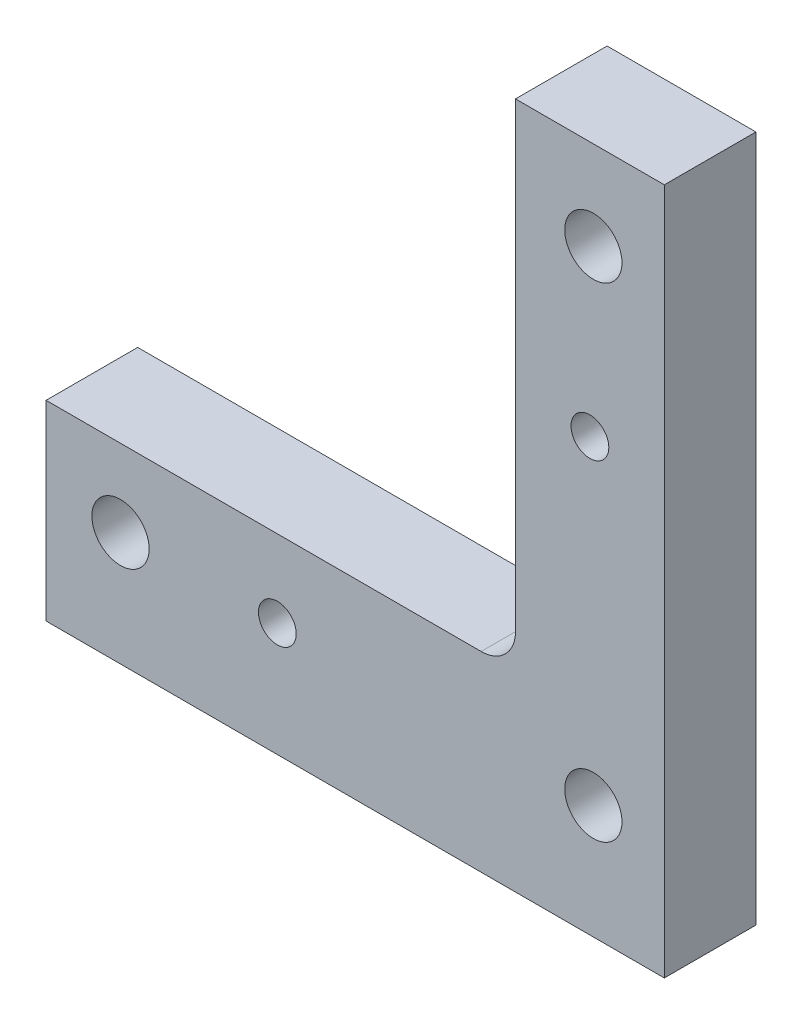
ISO-10303-21;
HEADER;
FILE_DESCRIPTION(('STEP AP214'),'2;1');
FILE_NAME('part.step','',(''),(''),'','','');
FILE_SCHEMA(('AUTOMOTIVE_DESIGN { 1 0 10303 214 1 1 1 1 }'));
ENDSEC;
DATA;
#1=APPLICATION_CONTEXT('core data for automotive mechanical design processes');
#2=APPLICATION_PROTOCOL_DEFINITION('international standard','automotive_design',2000,#1);
#3=PRODUCT_CONTEXT('',#1,'mechanical');
#4=PRODUCT('Part','Part','',(#3));
#5=PRODUCT_RELATED_PRODUCT_CATEGORY('part','',(#4));
#6=PRODUCT_DEFINITION_FORMATION('','',#4);
#7=PRODUCT_DEFINITION_CONTEXT('part definition',#1,'design');
#8=PRODUCT_DEFINITION('design','',#6,#7);
#9=PRODUCT_DEFINITION_SHAPE('','',#8);
#10=(LENGTH_UNIT() NAMED_UNIT(*) SI_UNIT(.MILLI.,.METRE.));
#11=(NAMED_UNIT(*) PLANE_ANGLE_UNIT() SI_UNIT($,.RADIAN.));
#12=(NAMED_UNIT(*) SI_UNIT($,.STERADIAN.) SOLID_ANGLE_UNIT());
#13=UNCERTAINTY_MEASURE_WITH_UNIT(LENGTH_MEASURE(1.E-05),#10,'distance_accuracy_value','');
#14=(GEOMETRIC_REPRESENTATION_CONTEXT(3) GLOBAL_UNCERTAINTY_ASSIGNED_CONTEXT((#13)) GLOBAL_UNIT_ASSIGNED_CONTEXT((#10,
#11,#12)) REPRESENTATION_CONTEXT('',''));
#15=CARTESIAN_POINT('',(0.,0.,0.));
#16=DIRECTION('',(0.,0.,1.));
#17=DIRECTION('',(1.,0.,0.));
#18=AXIS2_PLACEMENT_3D('',#15,#16,#17);
#19=CARTESIAN_POINT('',(20.2,9.95000000000001,0.));
#20=DIRECTION('',(0.,0.,1.));
#21=DIRECTION('',(1.,0.,0.));
#22=AXIS2_PLACEMENT_3D('',#19,#20,#21);
#23=CYLINDRICAL_SURFACE('',#22,1.65);
#24=CARTESIAN_POINT('',(20.2,9.95000000000001,0.));
#25=DIRECTION('',(0.,0.,1.));
#26=DIRECTION('',(1.,0.,0.));
#27=AXIS2_PLACEMENT_3D('',#24,#25,#26);
#28=CIRCLE('',#27,1.65);
#29=CARTESIAN_POINT('',(21.85,9.95000000000001,0.));
#30=VERTEX_POINT('',#29);
#31=EDGE_CURVE('E117',#30,#30,#28,.T.);
#32=ORIENTED_EDGE('',*,*,#31,.F.);
#33=EDGE_LOOP('',(#32));
#34=FACE_BOUND('',#33,.T.);
#35=CARTESIAN_POINT('',(20.2,9.95000000000001,8.));
#36=DIRECTION('',(0.,0.,1.));
#37=DIRECTION('',(1.,0.,0.));
#38=AXIS2_PLACEMENT_3D('',#35,#36,#37);
#39=CIRCLE('',#38,1.65);
#40=CARTESIAN_POINT('',(21.85,9.95000000000001,8.));
#41=VERTEX_POINT('',#40);
#42=EDGE_CURVE('E11',#41,#41,#39,.T.);
#43=ORIENTED_EDGE('',*,*,#42,.T.);
#44=EDGE_LOOP('',(#43));
#45=FACE_BOUND('',#44,.T.);
#46=ADVANCED_FACE('F16',(#34,#45),#23,.F.);
#47=CARTESIAN_POINT('',(47.8,9.95,0.));
#48=DIRECTION('',(0.,0.,1.));
#49=DIRECTION('',(1.,0.,0.));
#50=AXIS2_PLACEMENT_3D('',#47,#48,#49);
#51=CYLINDRICAL_SURFACE('',#50,2.5);
#52=CARTESIAN_POINT('',(47.8,9.95,0.));
#53=DIRECTION('',(0.,0.,1.));
#54=DIRECTION('',(1.,0.,0.));
#55=AXIS2_PLACEMENT_3D('',#52,#53,#54);
#56=CIRCLE('',#55,2.5);
#57=CARTESIAN_POINT('',(50.3,9.95,0.));
#58=VERTEX_POINT('',#57);
#59=EDGE_CURVE('E172',#58,#58,#56,.T.);
#60=ORIENTED_EDGE('',*,*,#59,.F.);
#61=EDGE_LOOP('',(#60));
#62=FACE_BOUND('',#61,.T.);
#63=CARTESIAN_POINT('',(47.8,9.95,8.));
#64=DIRECTION('',(0.,0.,1.));
#65=DIRECTION('',(1.,0.,0.));
#66=AXIS2_PLACEMENT_3D('',#63,#64,#65);
#67=CIRCLE('',#66,2.5);
#68=CARTESIAN_POINT('',(50.3,9.95,8.));
#69=VERTEX_POINT('',#68);
#70=EDGE_CURVE('E25',#69,#69,#67,.T.);
#71=ORIENTED_EDGE('',*,*,#70,.T.);
#72=EDGE_LOOP('',(#71));
#73=FACE_BOUND('',#72,.T.);
#74=ADVANCED_FACE('F183',(#62,#73),#51,.F.);
#75=CARTESIAN_POINT('',(47.5,37.7,0.));
#76=DIRECTION('',(0.,0.,1.));
#77=DIRECTION('',(1.,0.,0.));
#78=AXIS2_PLACEMENT_3D('',#75,#76,#77);
#79=CYLINDRICAL_SURFACE('',#78,1.64999999999999);
#80=CARTESIAN_POINT('',(47.5,37.7,0.));
#81=DIRECTION('',(0.,0.,1.));
#82=DIRECTION('',(1.,0.,0.));
#83=AXIS2_PLACEMENT_3D('',#80,#81,#82);
#84=CIRCLE('',#83,1.64999999999999);
#85=CARTESIAN_POINT('',(49.15,37.7,0.));
#86=VERTEX_POINT('',#85);
#87=EDGE_CURVE('E167',#86,#86,#84,.T.);
#88=ORIENTED_EDGE('',*,*,#87,.F.);
#89=EDGE_LOOP('',(#88));
#90=FACE_BOUND('',#89,.T.);
#91=CARTESIAN_POINT('',(47.5,37.7,8.));
#92=DIRECTION('',(0.,0.,1.));
#93=DIRECTION('',(1.,0.,0.));
#94=AXIS2_PLACEMENT_3D('',#91,#92,#93);
#95=CIRCLE('',#94,1.64999999999999);
#96=CARTESIAN_POINT('',(49.15,37.7,8.));
#97=VERTEX_POINT('',#96);
#98=EDGE_CURVE('E164',#97,#97,#95,.T.);
#99=ORIENTED_EDGE('',*,*,#98,.T.);
#100=EDGE_LOOP('',(#99));
#101=FACE_BOUND('',#100,.T.);
#102=ADVANCED_FACE('F212',(#90,#101),#79,.F.);
#103=CARTESIAN_POINT('',(6.5,9.95,0.));
#104=DIRECTION('',(0.,0.,1.));
#105=DIRECTION('',(1.,0.,0.));
#106=AXIS2_PLACEMENT_3D('',#103,#104,#105);
#107=CYLINDRICAL_SURFACE('',#106,2.5);
#108=CARTESIAN_POINT('',(6.5,9.95,0.));
#109=DIRECTION('',(0.,0.,1.));
#110=DIRECTION('',(1.,0.,0.));
#111=AXIS2_PLACEMENT_3D('',#108,#109,#110);
#112=CIRCLE('',#111,2.5);
#113=CARTESIAN_POINT('',(9.,9.95,0.));
#114=VERTEX_POINT('',#113);
#115=EDGE_CURVE('E161',#114,#114,#112,.T.);
#116=ORIENTED_EDGE('',*,*,#115,.F.);
#117=EDGE_LOOP('',(#116));
#118=FACE_BOUND('',#117,.T.);
#119=CARTESIAN_POINT('',(6.5,9.95,8.));
#120=DIRECTION('',(0.,0.,1.));
#121=DIRECTION('',(1.,0.,0.));
#122=AXIS2_PLACEMENT_3D('',#119,#120,#121);
#123=CIRCLE('',#122,2.5);
#124=CARTESIAN_POINT('',(9.,9.95,8.));
#125=VERTEX_POINT('',#124);
#126=EDGE_CURVE('E157',#125,#125,#123,.T.);
#127=ORIENTED_EDGE('',*,*,#126,.T.);
#128=EDGE_LOOP('',(#127));
#129=FACE_BOUND('',#128,.T.);
#130=ADVANCED_FACE('F202',(#118,#129),#107,.F.);
#131=CARTESIAN_POINT('',(47.8,52.25,0.));
#132=DIRECTION('',(0.,0.,1.));
#133=DIRECTION('',(1.,0.,0.));
#134=AXIS2_PLACEMENT_3D('',#131,#132,#133);
#135=CYLINDRICAL_SURFACE('',#134,2.5);
#136=CARTESIAN_POINT('',(47.8,52.25,0.));
#137=DIRECTION('',(0.,0.,1.));
#138=DIRECTION('',(1.,0.,0.));
#139=AXIS2_PLACEMENT_3D('',#136,#137,#138);
#140=CIRCLE('',#139,2.5);
#141=CARTESIAN_POINT('',(50.3,52.25,0.));
#142=VERTEX_POINT('',#141);
#143=EDGE_CURVE('E158',#142,#142,#140,.T.);
#144=ORIENTED_EDGE('',*,*,#143,.F.);
#145=EDGE_LOOP('',(#144));
#146=FACE_BOUND('',#145,.T.);
#147=CARTESIAN_POINT('',(47.8,52.25,8.));
#148=DIRECTION('',(0.,0.,1.));
#149=DIRECTION('',(1.,0.,0.));
#150=AXIS2_PLACEMENT_3D('',#147,#148,#149);
#151=CIRCLE('',#150,2.5);
#152=CARTESIAN_POINT('',(50.3,52.25,8.));
#153=VERTEX_POINT('',#152);
#154=EDGE_CURVE('E152',#153,#153,#151,.T.);
#155=ORIENTED_EDGE('',*,*,#154,.T.);
#156=EDGE_LOOP('',(#155));
#157=FACE_BOUND('',#156,.T.);
#158=ADVANCED_FACE('F199',(#146,#157),#135,.F.);
#159=CARTESIAN_POINT('',(13.,0.,3.99999999999999));
#160=DIRECTION('',(0.,-1.,0.));
#161=DIRECTION('',(0.,0.,-1.));
#162=AXIS2_PLACEMENT_3D('',#159,#160,#161);
#163=CYLINDRICAL_SURFACE('',#162,1.64999999999999);
#164=CARTESIAN_POINT('',(13.,10.,3.99999999999999));
#165=DIRECTION('',(0.,-1.,0.));
#166=DIRECTION('',(0.,0.,-1.));
#167=AXIS2_PLACEMENT_3D('',#164,#165,#166);
#168=CIRCLE('',#167,1.65);
#169=CARTESIAN_POINT('',(13.,10.,2.35));
#170=VERTEX_POINT('',#169);
#171=EDGE_CURVE('E146',#170,#170,#168,.T.);
#172=ORIENTED_EDGE('',*,*,#171,.F.);
#173=EDGE_LOOP('',(#172));
#174=FACE_BOUND('',#173,.T.);
#175=CARTESIAN_POINT('',(13.,0.,3.99999999999999));
#176=DIRECTION('',(0.,-1.,0.));
#177=DIRECTION('',(0.,0.,-1.));
#178=AXIS2_PLACEMENT_3D('',#175,#176,#177);
#179=CIRCLE('',#178,1.64999999999999);
#180=CARTESIAN_POINT('',(13.,0.,2.35));
#181=VERTEX_POINT('',#180);
#182=EDGE_CURVE('E149',#181,#181,#179,.T.);
#183=ORIENTED_EDGE('',*,*,#182,.T.);
#184=EDGE_LOOP('',(#183));
#185=FACE_BOUND('',#184,.T.);
#186=ADVANCED_FACE('F201',(#174,#185),#163,.F.);
#187=CARTESIAN_POINT('',(13.,10.,3.99999999999999));
#188=DIRECTION('',(0.,-1.,0.));
#189=DIRECTION('',(0.,0.,-1.));
#190=AXIS2_PLACEMENT_3D('',#187,#188,#189);
#191=CONICAL_SURFACE('',#190,1.65,1.02974425867665);
#192=CARTESIAN_POINT('',(13.,10.9914200213955,3.99999999999999));
#193=VERTEX_POINT('',#192);
#194=VERTEX_LOOP('',#193);
#195=FACE_BOUND('',#194,.T.);
#196=ORIENTED_EDGE('',*,*,#171,.T.);
#197=EDGE_LOOP('',(#196));
#198=FACE_BOUND('',#197,.T.);
#199=ADVANCED_FACE('F210',(#195,#198),#191,.F.);
#200=CARTESIAN_POINT('',(41.,0.,4.));
#201=DIRECTION('',(0.,-1.,0.));
#202=DIRECTION('',(0.,0.,-1.));
#203=AXIS2_PLACEMENT_3D('',#200,#201,#202);
#204=CYLINDRICAL_SURFACE('',#203,1.65);
#205=CARTESIAN_POINT('',(41.,10.,4.));
#206=DIRECTION('',(0.,-1.,0.));
#207=DIRECTION('',(0.,0.,-1.));
#208=AXIS2_PLACEMENT_3D('',#205,#206,#207);
#209=CIRCLE('',#208,1.65);
#210=CARTESIAN_POINT('',(41.,10.,2.35));
#211=VERTEX_POINT('',#210);
#212=EDGE_CURVE('E97',#211,#211,#209,.T.);
#213=ORIENTED_EDGE('',*,*,#212,.F.);
#214=EDGE_LOOP('',(#213));
#215=FACE_BOUND('',#214,.T.);
#216=CARTESIAN_POINT('',(41.,0.,4.));
#217=DIRECTION('',(0.,-1.,0.));
#218=DIRECTION('',(0.,0.,-1.));
#219=AXIS2_PLACEMENT_3D('',#216,#217,#218);
#220=CIRCLE('',#219,1.64999999999999);
#221=CARTESIAN_POINT('',(41.,0.,2.35));
#222=VERTEX_POINT('',#221);
#223=EDGE_CURVE('E143',#222,#222,#220,.T.);
#224=ORIENTED_EDGE('',*,*,#223,.T.);
#225=EDGE_LOOP('',(#224));
#226=FACE_BOUND('',#225,.T.);
#227=ADVANCED_FACE('F221',(#215,#226),#204,.F.);
#228=CARTESIAN_POINT('',(41.,10.,4.));
#229=DIRECTION('',(0.,-1.,0.));
#230=DIRECTION('',(0.,0.,-1.));
#231=AXIS2_PLACEMENT_3D('',#228,#229,#230);
#232=CONICAL_SURFACE('',#231,1.65,1.02974425867665);
#233=CARTESIAN_POINT('',(41.,10.9914200213955,4.));
#234=VERTEX_POINT('',#233);
#235=VERTEX_LOOP('',#234);
#236=FACE_BOUND('',#235,.T.);
#237=ORIENTED_EDGE('',*,*,#212,.T.);
#238=EDGE_LOOP('',(#237));
#239=FACE_BOUND('',#238,.T.);
#240=ADVANCED_FACE('F218',(#236,#239),#232,.F.);
#241=CARTESIAN_POINT('',(0.,16.7,8.));
#242=DIRECTION('',(1.,0.,0.));
#243=DIRECTION('',(0.,1.,0.));
#244=AXIS2_PLACEMENT_3D('',#241,#242,#243);
#245=PLANE('',#244);
#246=DIRECTION('',(0.,-1.,0.));
#247=VECTOR('',#246,1.);
#248=CARTESIAN_POINT('',(0.,16.7,0.));
#249=LINE('',#248,#247);
#250=CARTESIAN_POINT('',(0.,16.7,0.));
#251=VERTEX_POINT('',#250);
#252=CARTESIAN_POINT('',(0.,0.,0.));
#253=VERTEX_POINT('',#252);
#254=EDGE_CURVE('E81',#251,#253,#249,.T.);
#255=ORIENTED_EDGE('',*,*,#254,.T.);
#256=DIRECTION('',(0.,0.,-1.));
#257=VECTOR('',#256,1.);
#258=CARTESIAN_POINT('',(0.,0.,8.));
#259=LINE('',#258,#257);
#260=CARTESIAN_POINT('',(0.,0.,8.));
#261=VERTEX_POINT('',#260);
#262=EDGE_CURVE('E138',#261,#253,#259,.T.);
#263=ORIENTED_EDGE('',*,*,#262,.F.);
#264=DIRECTION('',(0.,-1.,0.));
#265=VECTOR('',#264,1.);
#266=CARTESIAN_POINT('',(0.,16.7,8.));
#267=LINE('',#266,#265);
#268=CARTESIAN_POINT('',(0.,16.7,8.));
#269=VERTEX_POINT('',#268);
#270=EDGE_CURVE('E83',#269,#261,#267,.T.);
#271=ORIENTED_EDGE('',*,*,#270,.F.);
#272=DIRECTION('',(0.,0.,-1.));
#273=VECTOR('',#272,1.);
#274=CARTESIAN_POINT('',(0.,16.7,8.));
#275=LINE('',#274,#273);
#276=EDGE_CURVE('E77',#269,#251,#275,.T.);
#277=ORIENTED_EDGE('',*,*,#276,.T.);
#278=EDGE_LOOP('',(#255,#263,#271,#277));
#279=FACE_BOUND('',#278,.T.);
#280=ADVANCED_FACE('F79',(#279),#245,.F.);
#281=CARTESIAN_POINT('',(0.,0.,8.));
#282=DIRECTION('',(0.,1.,0.));
#283=DIRECTION('',(0.,0.,1.));
#284=AXIS2_PLACEMENT_3D('',#281,#282,#283);
#285=PLANE('',#284);
#286=DIRECTION('',(1.,0.,0.));
#287=VECTOR('',#286,1.);
#288=CARTESIAN_POINT('',(0.,0.,0.));
#289=LINE('',#288,#287);
#290=CARTESIAN_POINT('',(54.,0.,0.));
#291=VERTEX_POINT('',#290);
#292=EDGE_CURVE('E87',#253,#291,#289,.T.);
#293=ORIENTED_EDGE('',*,*,#292,.T.);
#294=DIRECTION('',(0.,0.,-1.));
#295=VECTOR('',#294,1.);
#296=CARTESIAN_POINT('',(54.,0.,8.));
#297=LINE('',#296,#295);
#298=CARTESIAN_POINT('',(54.,0.,8.));
#299=VERTEX_POINT('',#298);
#300=EDGE_CURVE('E132',#299,#291,#297,.T.);
#301=ORIENTED_EDGE('',*,*,#300,.F.);
#302=DIRECTION('',(1.,0.,0.));
#303=VECTOR('',#302,1.);
#304=CARTESIAN_POINT('',(0.,0.,8.));
#305=LINE('',#304,#303);
#306=EDGE_CURVE('E106',#261,#299,#305,.T.);
#307=ORIENTED_EDGE('',*,*,#306,.F.);
#308=ORIENTED_EDGE('',*,*,#262,.T.);
#309=EDGE_LOOP('',(#293,#301,#307,#308));
#310=FACE_BOUND('',#309,.T.);
#311=ORIENTED_EDGE('',*,*,#182,.F.);
#312=EDGE_LOOP('',(#311));
#313=FACE_BOUND('',#312,.T.);
#314=ORIENTED_EDGE('',*,*,#223,.F.);
#315=EDGE_LOOP('',(#314));
#316=FACE_BOUND('',#315,.T.);
#317=ADVANCED_FACE('F231',(#310,#313,#316),#285,.F.);
#318=CARTESIAN_POINT('',(54.,0.,8.));
#319=DIRECTION('',(-1.,0.,0.));
#320=DIRECTION('',(0.,0.,1.));
#321=AXIS2_PLACEMENT_3D('',#318,#319,#320);
#322=PLANE('',#321);
#323=DIRECTION('',(0.,1.,0.));
#324=VECTOR('',#323,1.);
#325=CARTESIAN_POINT('',(54.,0.,0.));
#326=LINE('',#325,#324);
#327=CARTESIAN_POINT('',(54.,60.,0.));
#328=VERTEX_POINT('',#327);
#329=EDGE_CURVE('E135',#291,#328,#326,.T.);
#330=ORIENTED_EDGE('',*,*,#329,.T.);
#331=DIRECTION('',(0.,0.,-1.));
#332=VECTOR('',#331,1.);
#333=CARTESIAN_POINT('',(54.,60.,8.));
#334=LINE('',#333,#332);
#335=CARTESIAN_POINT('',(54.,60.,8.));
#336=VERTEX_POINT('',#335);
#337=EDGE_CURVE('E125',#336,#328,#334,.T.);
#338=ORIENTED_EDGE('',*,*,#337,.F.);
#339=DIRECTION('',(0.,1.,0.));
#340=VECTOR('',#339,1.);
#341=CARTESIAN_POINT('',(54.,0.,8.));
#342=LINE('',#341,#340);
#343=EDGE_CURVE('E127',#299,#336,#342,.T.);
#344=ORIENTED_EDGE('',*,*,#343,.F.);
#345=ORIENTED_EDGE('',*,*,#300,.T.);
#346=EDGE_LOOP('',(#330,#338,#344,#345));
#347=FACE_BOUND('',#346,.T.);
#348=ADVANCED_FACE('F233',(#347),#322,.F.);
#349=CARTESIAN_POINT('',(54.,60.,8.));
#350=DIRECTION('',(0.,-1.,0.));
#351=DIRECTION('',(0.,0.,-1.));
#352=AXIS2_PLACEMENT_3D('',#349,#350,#351);
#353=PLANE('',#352);
#354=DIRECTION('',(-1.,0.,0.));
#355=VECTOR('',#354,1.);
#356=CARTESIAN_POINT('',(54.,60.,0.));
#357=LINE('',#356,#355);
#358=CARTESIAN_POINT('',(41.,60.,0.));
#359=VERTEX_POINT('',#358);
#360=EDGE_CURVE('E129',#328,#359,#357,.T.);
#361=ORIENTED_EDGE('',*,*,#360,.T.);
#362=DIRECTION('',(0.,0.,-1.));
#363=VECTOR('',#362,1.);
#364=CARTESIAN_POINT('',(41.,60.,8.));
#365=LINE('',#364,#363);
#366=CARTESIAN_POINT('',(41.,60.,8.));
#367=VERTEX_POINT('',#366);
#368=EDGE_CURVE('E104',#367,#359,#365,.T.);
#369=ORIENTED_EDGE('',*,*,#368,.F.);
#370=DIRECTION('',(-1.,0.,0.));
#371=VECTOR('',#370,1.);
#372=CARTESIAN_POINT('',(54.,60.,8.));
#373=LINE('',#372,#371);
#374=EDGE_CURVE('E115',#336,#367,#373,.T.);
#375=ORIENTED_EDGE('',*,*,#374,.F.);
#376=ORIENTED_EDGE('',*,*,#337,.T.);
#377=EDGE_LOOP('',(#361,#369,#375,#376));
#378=FACE_BOUND('',#377,.T.);
#379=ADVANCED_FACE('F240',(#378),#353,.F.);
#380=CARTESIAN_POINT('',(41.,60.,8.));
#381=DIRECTION('',(1.,0.,0.));
#382=DIRECTION('',(0.,1.,0.));
#383=AXIS2_PLACEMENT_3D('',#380,#381,#382);
#384=PLANE('',#383);
#385=DIRECTION('',(0.,-1.,0.));
#386=VECTOR('',#385,1.);
#387=CARTESIAN_POINT('',(41.,60.,0.));
#388=LINE('',#387,#386);
#389=CARTESIAN_POINT('',(41.,19.7,0.));
#390=VERTEX_POINT('',#389);
#391=EDGE_CURVE('E122',#359,#390,#388,.T.);
#392=ORIENTED_EDGE('',*,*,#391,.T.);
#393=DIRECTION('',(0.,0.,1.));
#394=VECTOR('',#393,1.);
#395=CARTESIAN_POINT('',(41.,19.7,8.));
#396=LINE('',#395,#394);
#397=CARTESIAN_POINT('',(41.,19.7,8.));
#398=VERTEX_POINT('',#397);
#399=EDGE_CURVE('E119',#390,#398,#396,.T.);
#400=ORIENTED_EDGE('',*,*,#399,.T.);
#401=DIRECTION('',(0.,-1.,0.));
#402=VECTOR('',#401,1.);
#403=CARTESIAN_POINT('',(41.,60.,8.));
#404=LINE('',#403,#402);
#405=EDGE_CURVE('E111',#367,#398,#404,.T.);
#406=ORIENTED_EDGE('',*,*,#405,.F.);
#407=ORIENTED_EDGE('',*,*,#368,.T.);
#408=EDGE_LOOP('',(#392,#400,#406,#407));
#409=FACE_BOUND('',#408,.T.);
#410=ADVANCED_FACE('F248',(#409),#384,.F.);
#411=CARTESIAN_POINT('',(41.,16.7,8.));
#412=DIRECTION('',(0.,-1.,0.));
#413=DIRECTION('',(1.,0.,0.));
#414=AXIS2_PLACEMENT_3D('',#411,#412,#413);
#415=PLANE('',#414);
#416=DIRECTION('',(-1.,0.,0.));
#417=VECTOR('',#416,1.);
#418=CARTESIAN_POINT('',(41.,16.7,8.));
#419=LINE('',#418,#417);
#420=CARTESIAN_POINT('',(38.,16.7,8.));
#421=VERTEX_POINT('',#420);
#422=EDGE_CURVE('E112',#421,#269,#419,.T.);
#423=ORIENTED_EDGE('',*,*,#422,.F.);
#424=DIRECTION('',(0.,0.,-1.));
#425=VECTOR('',#424,1.);
#426=CARTESIAN_POINT('',(38.,16.7,0.));
#427=LINE('',#426,#425);
#428=CARTESIAN_POINT('',(38.,16.7,0.));
#429=VERTEX_POINT('',#428);
#430=EDGE_CURVE('E101',#421,#429,#427,.T.);
#431=ORIENTED_EDGE('',*,*,#430,.T.);
#432=DIRECTION('',(-1.,0.,0.));
#433=VECTOR('',#432,1.);
#434=CARTESIAN_POINT('',(41.,16.7,0.));
#435=LINE('',#434,#433);
#436=EDGE_CURVE('E93',#429,#251,#435,.T.);
#437=ORIENTED_EDGE('',*,*,#436,.T.);
#438=ORIENTED_EDGE('',*,*,#276,.F.);
#439=EDGE_LOOP('',(#423,#431,#437,#438));
#440=FACE_BOUND('',#439,.T.);
#441=ADVANCED_FACE('F99',(#440),#415,.F.);
#442=CARTESIAN_POINT('',(0.,0.,8.));
#443=DIRECTION('',(0.,0.,1.));
#444=DIRECTION('',(1.,0.,0.));
#445=AXIS2_PLACEMENT_3D('',#442,#443,#444);
#446=PLANE('',#445);
#447=ORIENTED_EDGE('',*,*,#270,.T.);
#448=ORIENTED_EDGE('',*,*,#306,.T.);
#449=ORIENTED_EDGE('',*,*,#343,.T.);
#450=ORIENTED_EDGE('',*,*,#374,.T.);
#451=ORIENTED_EDGE('',*,*,#405,.T.);
#452=CARTESIAN_POINT('',(38.,19.7,8.));
#453=DIRECTION('',(0.,0.,-1.));
#454=DIRECTION('',(0.,-1.,0.));
#455=AXIS2_PLACEMENT_3D('',#452,#453,#454);
#456=CIRCLE('',#455,3.);
#457=EDGE_CURVE('E109',#398,#421,#456,.T.);
#458=ORIENTED_EDGE('',*,*,#457,.T.);
#459=ORIENTED_EDGE('',*,*,#422,.T.);
#460=EDGE_LOOP('',(#447,#448,#449,#450,#451,#458,#459));
#461=FACE_BOUND('',#460,.T.);
#462=ORIENTED_EDGE('',*,*,#42,.F.);
#463=EDGE_LOOP('',(#462));
#464=FACE_BOUND('',#463,.T.);
#465=ORIENTED_EDGE('',*,*,#70,.F.);
#466=EDGE_LOOP('',(#465));
#467=FACE_BOUND('',#466,.T.);
#468=ORIENTED_EDGE('',*,*,#98,.F.);
#469=EDGE_LOOP('',(#468));
#470=FACE_BOUND('',#469,.T.);
#471=ORIENTED_EDGE('',*,*,#126,.F.);
#472=EDGE_LOOP('',(#471));
#473=FACE_BOUND('',#472,.T.);
#474=ORIENTED_EDGE('',*,*,#154,.F.);
#475=EDGE_LOOP('',(#474));
#476=FACE_BOUND('',#475,.T.);
#477=ADVANCED_FACE('F187',(#461,#464,#467,#470,#473,#476),#446,.T.);
#478=CARTESIAN_POINT('',(0.,0.,0.));
#479=DIRECTION('',(0.,0.,1.));
#480=DIRECTION('',(1.,0.,0.));
#481=AXIS2_PLACEMENT_3D('',#478,#479,#480);
#482=PLANE('',#481);
#483=ORIENTED_EDGE('',*,*,#254,.F.);
#484=ORIENTED_EDGE('',*,*,#436,.F.);
#485=CARTESIAN_POINT('',(38.,19.7,0.));
#486=DIRECTION('',(0.,0.,1.));
#487=DIRECTION('',(1.,0.,0.));
#488=AXIS2_PLACEMENT_3D('',#485,#486,#487);
#489=CIRCLE('',#488,3.);
#490=EDGE_CURVE('E20',#429,#390,#489,.T.);
#491=ORIENTED_EDGE('',*,*,#490,.T.);
#492=ORIENTED_EDGE('',*,*,#391,.F.);
#493=ORIENTED_EDGE('',*,*,#360,.F.);
#494=ORIENTED_EDGE('',*,*,#329,.F.);
#495=ORIENTED_EDGE('',*,*,#292,.F.);
#496=EDGE_LOOP('',(#483,#484,#491,#492,#493,#494,#495));
#497=FACE_BOUND('',#496,.T.);
#498=ORIENTED_EDGE('',*,*,#31,.T.);
#499=EDGE_LOOP('',(#498));
#500=FACE_BOUND('',#499,.T.);
#501=ORIENTED_EDGE('',*,*,#59,.T.);
#502=EDGE_LOOP('',(#501));
#503=FACE_BOUND('',#502,.T.);
#504=ORIENTED_EDGE('',*,*,#87,.T.);
#505=EDGE_LOOP('',(#504));
#506=FACE_BOUND('',#505,.T.);
#507=ORIENTED_EDGE('',*,*,#115,.T.);
#508=EDGE_LOOP('',(#507));
#509=FACE_BOUND('',#508,.T.);
#510=ORIENTED_EDGE('',*,*,#143,.T.);
#511=EDGE_LOOP('',(#510));
#512=FACE_BOUND('',#511,.T.);
#513=ADVANCED_FACE('F90',(#497,#500,#503,#506,#509,#512),#482,.F.);
#514=CARTESIAN_POINT('',(38.,19.7,8.));
#515=DIRECTION('',(0.,0.,1.));
#516=DIRECTION('',(1.,0.,0.));
#517=AXIS2_PLACEMENT_3D('',#514,#515,#516);
#518=CYLINDRICAL_SURFACE('',#517,3.);
#519=ORIENTED_EDGE('',*,*,#457,.F.);
#520=ORIENTED_EDGE('',*,*,#399,.F.);
#521=ORIENTED_EDGE('',*,*,#490,.F.);
#522=ORIENTED_EDGE('',*,*,#430,.F.);
#523=EDGE_LOOP('',(#519,#520,#521,#522));
#524=FACE_BOUND('',#523,.T.);
#525=ADVANCED_FACE('F18',(#524),#518,.F.);
#526=CLOSED_SHELL('',(#46,#74,#102,#130,#158,#186,#199,#227,#240,#280,#317,#348,#379,#410,#441,
#477,#513,#525));
#527=MANIFOLD_SOLID_BREP('B1',#526);
#528=ADVANCED_BREP_SHAPE_REPRESENTATION('',(#18,#527),#14);
#529=SHAPE_DEFINITION_REPRESENTATION(#9,#528);
ENDSEC;
END-ISO-10303-21;
